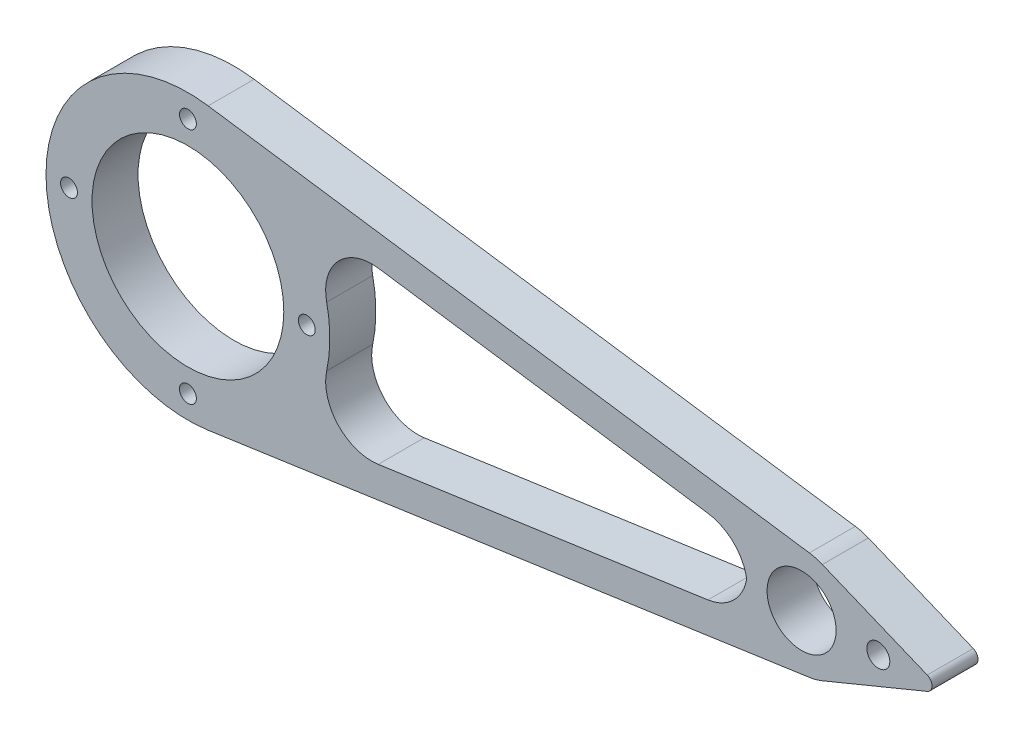
ISO-10303-21;
HEADER;
FILE_DESCRIPTION(('STEP AP214'),'2;1');
FILE_NAME('part.step','',(''),(''),'','','');
FILE_SCHEMA(('AUTOMOTIVE_DESIGN { 1 0 10303 214 1 1 1 1 }'));
ENDSEC;
DATA;
#1=APPLICATION_CONTEXT('core data for automotive mechanical design processes');
#2=APPLICATION_PROTOCOL_DEFINITION('international standard','automotive_design',2000,#1);
#3=PRODUCT_CONTEXT('',#1,'mechanical');
#4=PRODUCT('Part','Part','',(#3));
#5=PRODUCT_RELATED_PRODUCT_CATEGORY('part','',(#4));
#6=PRODUCT_DEFINITION_FORMATION('','',#4);
#7=PRODUCT_DEFINITION_CONTEXT('part definition',#1,'design');
#8=PRODUCT_DEFINITION('design','',#6,#7);
#9=PRODUCT_DEFINITION_SHAPE('','',#8);
#10=(LENGTH_UNIT() NAMED_UNIT(*) SI_UNIT(.MILLI.,.METRE.));
#11=(NAMED_UNIT(*) PLANE_ANGLE_UNIT() SI_UNIT($,.RADIAN.));
#12=(NAMED_UNIT(*) SI_UNIT($,.STERADIAN.) SOLID_ANGLE_UNIT());
#13=UNCERTAINTY_MEASURE_WITH_UNIT(LENGTH_MEASURE(1.E-05),#10,'distance_accuracy_value','');
#14=(GEOMETRIC_REPRESENTATION_CONTEXT(3) GLOBAL_UNCERTAINTY_ASSIGNED_CONTEXT((#13)) GLOBAL_UNIT_ASSIGNED_CONTEXT((#10,
#11,#12)) REPRESENTATION_CONTEXT('',''));
#15=CARTESIAN_POINT('',(0.,0.,0.));
#16=DIRECTION('',(0.,0.,1.));
#17=DIRECTION('',(1.,0.,0.));
#18=AXIS2_PLACEMENT_3D('',#15,#16,#17);
#19=CARTESIAN_POINT('',(80.,0.,0.));
#20=DIRECTION('',(0.,0.,1.));
#21=DIRECTION('',(1.,0.,0.));
#22=AXIS2_PLACEMENT_3D('',#19,#20,#21);
#23=CYLINDRICAL_SURFACE('',#22,7.09999999999999);
#24=CARTESIAN_POINT('',(80.,0.,6.));
#25=DIRECTION('',(0.,0.,1.));
#26=DIRECTION('',(1.,0.,0.));
#27=AXIS2_PLACEMENT_3D('',#24,#25,#26);
#28=CIRCLE('',#27,7.09999999999999);
#29=CARTESIAN_POINT('',(82.706875,6.5637510414682,6.));
#30=VERTEX_POINT('',#29);
#31=CARTESIAN_POINT('',(81.01175,7.02754309396249,6.));
#32=VERTEX_POINT('',#31);
#33=EDGE_CURVE('E181',#30,#32,#28,.T.);
#34=ORIENTED_EDGE('',*,*,#33,.F.);
#35=DIRECTION('',(0.,0.,1.));
#36=VECTOR('',#35,1.);
#37=CARTESIAN_POINT('',(82.706875,6.56375104146821,0.));
#38=LINE('',#37,#36);
#39=CARTESIAN_POINT('',(82.706875,6.56375104146821,0.));
#40=VERTEX_POINT('',#39);
#41=EDGE_CURVE('E321',#40,#30,#38,.T.);
#42=ORIENTED_EDGE('',*,*,#41,.F.);
#43=CARTESIAN_POINT('',(80.,0.,0.));
#44=DIRECTION('',(0.,0.,1.));
#45=DIRECTION('',(1.,0.,0.));
#46=AXIS2_PLACEMENT_3D('',#43,#44,#45);
#47=CIRCLE('',#46,7.09999999999999);
#48=CARTESIAN_POINT('',(81.01175,7.02754309396249,0.));
#49=VERTEX_POINT('',#48);
#50=EDGE_CURVE('E170',#40,#49,#47,.T.);
#51=ORIENTED_EDGE('',*,*,#50,.T.);
#52=DIRECTION('',(0.,0.,1.));
#53=VECTOR('',#52,1.);
#54=CARTESIAN_POINT('',(81.01175,7.02754309396249,0.));
#55=LINE('',#54,#53);
#56=EDGE_CURVE('E191',#49,#32,#55,.T.);
#57=ORIENTED_EDGE('',*,*,#56,.T.);
#58=EDGE_LOOP('',(#34,#42,#51,#57));
#59=FACE_BOUND('',#58,.T.);
#60=ADVANCED_FACE('F33',(#59),#23,.T.);
#61=CARTESIAN_POINT('',(0.,0.,6.));
#62=DIRECTION('',(0.,0.,1.));
#63=DIRECTION('',(1.,0.,0.));
#64=AXIS2_PLACEMENT_3D('',#61,#62,#63);
#65=PLANE('',#64);
#66=CARTESIAN_POINT('',(0.,0.,6.));
#67=DIRECTION('',(0.,0.,-1.));
#68=DIRECTION('',(1.,0.,0.));
#69=AXIS2_PLACEMENT_3D('',#66,#67,#68);
#70=CIRCLE('',#69,18.5);
#71=CARTESIAN_POINT('',(18.088471644346,3.88035997965291,6.));
#72=VERTEX_POINT('',#71);
#73=CARTESIAN_POINT('',(18.088471644346,-3.88035997965291,6.));
#74=VERTEX_POINT('',#73);
#75=EDGE_CURVE('E267',#72,#74,#70,.T.);
#76=ORIENTED_EDGE('',*,*,#75,.F.);
#77=CARTESIAN_POINT('',(23.9550029884582,5.13885510818899,6.));
#78=DIRECTION('',(0.,0.,1.));
#79=DIRECTION('',(1.,0.,0.));
#80=AXIS2_PLACEMENT_3D('',#77,#78,#79);
#81=CIRCLE('',#80,6.);
#82=CARTESIAN_POINT('',(24.8100029884582,11.0776239199883,6.));
#83=VERTEX_POINT('',#82);
#84=EDGE_CURVE('E42',#72,#83,#81,.F.);
#85=ORIENTED_EDGE('',*,*,#84,.T.);
#86=DIRECTION('',(-0.989794801966549,0.1425,0.));
#87=VECTOR('',#86,1.);
#88=CARTESIAN_POINT('',(13.4381264942291,12.7148242742516,6.));
#89=LINE('',#88,#87);
#90=CARTESIAN_POINT('',(67.7971456171021,4.88879790028084,6.));
#91=VERTEX_POINT('',#90);
#92=EDGE_CURVE('E264',#91,#83,#89,.T.);
#93=ORIENTED_EDGE('',*,*,#92,.F.);
#94=CARTESIAN_POINT('',(66.9421456171021,-1.04997091151846,6.));
#95=DIRECTION('',(0.,0.,1.));
#96=DIRECTION('',(1.,0.,0.));
#97=AXIS2_PLACEMENT_3D('',#94,#95,#96);
#98=CIRCLE('',#97,6.);
#99=CARTESIAN_POINT('',(72.8495613875524,0.,6.));
#100=VERTEX_POINT('',#99);
#101=EDGE_CURVE('E250',#91,#100,#98,.F.);
#102=ORIENTED_EDGE('',*,*,#101,.T.);
#103=CARTESIAN_POINT('',(66.9421456171021,1.04997091151846,6.));
#104=DIRECTION('',(0.,0.,1.));
#105=DIRECTION('',(1.,0.,0.));
#106=AXIS2_PLACEMENT_3D('',#103,#104,#105);
#107=CIRCLE('',#106,6.);
#108=CARTESIAN_POINT('',(67.7971456171021,-4.88879790028084,6.));
#109=VERTEX_POINT('',#108);
#110=EDGE_CURVE('E247',#100,#109,#107,.F.);
#111=ORIENTED_EDGE('',*,*,#110,.T.);
#112=DIRECTION('',(0.989794801966549,0.1425,0.));
#113=VECTOR('',#112,1.);
#114=CARTESIAN_POINT('',(13.4381264942291,-12.7148242742516,6.));
#115=LINE('',#114,#113);
#116=CARTESIAN_POINT('',(24.8100029884582,-11.0776239199883,6.));
#117=VERTEX_POINT('',#116);
#118=EDGE_CURVE('E277',#117,#109,#115,.T.);
#119=ORIENTED_EDGE('',*,*,#118,.F.);
#120=CARTESIAN_POINT('',(23.9550029884582,-5.13885510818899,6.));
#121=DIRECTION('',(0.,0.,1.));
#122=DIRECTION('',(1.,0.,0.));
#123=AXIS2_PLACEMENT_3D('',#120,#121,#122);
#124=CIRCLE('',#123,6.);
#125=EDGE_CURVE('E254',#117,#74,#124,.F.);
#126=ORIENTED_EDGE('',*,*,#125,.T.);
#127=EDGE_LOOP('',(#76,#85,#93,#102,#111,#119,#126));
#128=FACE_BOUND('',#127,.T.);
#129=CARTESIAN_POINT('',(3.40754351465061E-13,-15.5,6.));
#130=DIRECTION('',(0.,0.,1.));
#131=DIRECTION('',(1.,0.,0.));
#132=AXIS2_PLACEMENT_3D('',#129,#130,#131);
#133=CIRCLE('',#132,1.1);
#134=CARTESIAN_POINT('',(1.10000000000034,-15.5,6.));
#135=VERTEX_POINT('',#134);
#136=EDGE_CURVE('E203',#135,#135,#133,.T.);
#137=ORIENTED_EDGE('',*,*,#136,.F.);
#138=EDGE_LOOP('',(#137));
#139=FACE_BOUND('',#138,.T.);
#140=CARTESIAN_POINT('',(0.,0.,6.));
#141=DIRECTION('',(0.,0.,1.));
#142=DIRECTION('',(1.,0.,0.));
#143=AXIS2_PLACEMENT_3D('',#140,#141,#142);
#144=CIRCLE('',#143,12.5);
#145=CARTESIAN_POINT('',(12.5,0.,6.));
#146=VERTEX_POINT('',#145);
#147=EDGE_CURVE('E215',#146,#146,#144,.T.);
#148=ORIENTED_EDGE('',*,*,#147,.F.);
#149=EDGE_LOOP('',(#148));
#150=FACE_BOUND('',#149,.T.);
#151=CARTESIAN_POINT('',(0.,0.,6.));
#152=DIRECTION('',(0.,0.,1.));
#153=DIRECTION('',(1.,0.,0.));
#154=AXIS2_PLACEMENT_3D('',#151,#152,#153);
#155=CIRCLE('',#154,18.5);
#156=CARTESIAN_POINT('',(2.63625,18.3112038363812,6.));
#157=VERTEX_POINT('',#156);
#158=CARTESIAN_POINT('',(2.63625,-18.3112038363812,6.));
#159=VERTEX_POINT('',#158);
#160=EDGE_CURVE('E227',#157,#159,#155,.T.);
#161=ORIENTED_EDGE('',*,*,#160,.T.);
#162=DIRECTION('',(0.989794801966549,0.1425,0.));
#163=VECTOR('',#162,1.);
#164=CARTESIAN_POINT('',(2.63625,-18.3112038363812,6.));
#165=LINE('',#164,#163);
#166=CARTESIAN_POINT('',(81.01175,-7.02754309396249,6.));
#167=VERTEX_POINT('',#166);
#168=EDGE_CURVE('E178',#159,#167,#165,.T.);
#169=ORIENTED_EDGE('',*,*,#168,.T.);
#170=CARTESIAN_POINT('',(82.706875,-6.56375104146821,6.));
#171=VERTEX_POINT('',#170);
#172=EDGE_CURVE('E183',#167,#171,#28,.T.);
#173=ORIENTED_EDGE('',*,*,#172,.T.);
#174=DIRECTION('',(0.924471977671579,0.381249999999999,0.));
#175=VECTOR('',#174,1.);
#176=CARTESIAN_POINT('',(82.706875,-6.56375104146821,6.));
#177=LINE('',#176,#175);
#178=CARTESIAN_POINT('',(96.38125,-0.924471977671587,6.));
#179=VERTEX_POINT('',#178);
#180=EDGE_CURVE('E146',#171,#179,#177,.T.);
#181=ORIENTED_EDGE('',*,*,#180,.T.);
#182=CARTESIAN_POINT('',(96.,0.,6.));
#183=DIRECTION('',(0.,0.,1.));
#184=DIRECTION('',(1.,0.,0.));
#185=AXIS2_PLACEMENT_3D('',#182,#183,#184);
#186=CIRCLE('',#185,1.00000000000001);
#187=CARTESIAN_POINT('',(96.38125,0.924471977671587,6.));
#188=VERTEX_POINT('',#187);
#189=EDGE_CURVE('E318',#179,#188,#186,.T.);
#190=ORIENTED_EDGE('',*,*,#189,.T.);
#191=DIRECTION('',(-0.924471977671579,0.381249999999999,0.));
#192=VECTOR('',#191,1.);
#193=CARTESIAN_POINT('',(82.706875,6.56375104146821,6.));
#194=LINE('',#193,#192);
#195=EDGE_CURVE('E49',#188,#30,#194,.T.);
#196=ORIENTED_EDGE('',*,*,#195,.T.);
#197=ORIENTED_EDGE('',*,*,#33,.T.);
#198=DIRECTION('',(-0.989794801966549,0.1425,0.));
#199=VECTOR('',#198,1.);
#200=CARTESIAN_POINT('',(2.63625,18.3112038363812,6.));
#201=LINE('',#200,#199);
#202=EDGE_CURVE('E185',#32,#157,#201,.T.);
#203=ORIENTED_EDGE('',*,*,#202,.T.);
#204=EDGE_LOOP('',(#161,#169,#173,#181,#190,#196,#197,#203));
#205=FACE_BOUND('',#204,.T.);
#206=CARTESIAN_POINT('',(0.,15.5,6.));
#207=DIRECTION('',(0.,0.,1.));
#208=DIRECTION('',(1.,0.,0.));
#209=AXIS2_PLACEMENT_3D('',#206,#207,#208);
#210=CIRCLE('',#209,1.1);
#211=CARTESIAN_POINT('',(1.1,15.5,6.));
#212=VERTEX_POINT('',#211);
#213=EDGE_CURVE('E221',#212,#212,#210,.T.);
#214=ORIENTED_EDGE('',*,*,#213,.F.);
#215=EDGE_LOOP('',(#214));
#216=FACE_BOUND('',#215,.T.);
#217=CARTESIAN_POINT('',(15.5000000000002,1.70377175732531E-13,6.));
#218=DIRECTION('',(0.,0.,1.));
#219=DIRECTION('',(1.,0.,0.));
#220=AXIS2_PLACEMENT_3D('',#217,#218,#219);
#221=CIRCLE('',#220,1.1);
#222=CARTESIAN_POINT('',(16.6000000000002,1.70377175732531E-13,6.));
#223=VERTEX_POINT('',#222);
#224=EDGE_CURVE('E209',#223,#223,#221,.T.);
#225=ORIENTED_EDGE('',*,*,#224,.F.);
#226=EDGE_LOOP('',(#225));
#227=FACE_BOUND('',#226,.T.);
#228=CARTESIAN_POINT('',(-15.4999999999998,-1.72275378271209E-13,6.));
#229=DIRECTION('',(0.,0.,1.));
#230=DIRECTION('',(1.,0.,0.));
#231=AXIS2_PLACEMENT_3D('',#228,#229,#230);
#232=CIRCLE('',#231,1.1);
#233=CARTESIAN_POINT('',(-14.3999999999998,-1.72275378271209E-13,6.));
#234=VERTEX_POINT('',#233);
#235=EDGE_CURVE('E197',#234,#234,#232,.T.);
#236=ORIENTED_EDGE('',*,*,#235,.F.);
#237=EDGE_LOOP('',(#236));
#238=FACE_BOUND('',#237,.T.);
#239=CARTESIAN_POINT('',(80.,0.,6.));
#240=DIRECTION('',(0.,0.,1.));
#241=DIRECTION('',(1.,0.,0.));
#242=AXIS2_PLACEMENT_3D('',#239,#240,#241);
#243=CIRCLE('',#242,4.5);
#244=CARTESIAN_POINT('',(84.5,0.,6.));
#245=VERTEX_POINT('',#244);
#246=EDGE_CURVE('E293',#245,#245,#243,.T.);
#247=ORIENTED_EDGE('',*,*,#246,.F.);
#248=EDGE_LOOP('',(#247));
#249=FACE_BOUND('',#248,.T.);
#250=CARTESIAN_POINT('',(90.,0.,6.));
#251=DIRECTION('',(0.,0.,1.));
#252=DIRECTION('',(1.,0.,0.));
#253=AXIS2_PLACEMENT_3D('',#250,#251,#252);
#254=CIRCLE('',#253,1.5);
#255=CARTESIAN_POINT('',(91.5,0.,6.));
#256=VERTEX_POINT('',#255);
#257=EDGE_CURVE('E308',#256,#256,#254,.T.);
#258=ORIENTED_EDGE('',*,*,#257,.F.);
#259=EDGE_LOOP('',(#258));
#260=FACE_BOUND('',#259,.T.);
#261=ADVANCED_FACE('F262',(#128,#139,#150,#205,#216,#227,#238,#249,#260),#65,.T.);
#262=CARTESIAN_POINT('',(0.,0.,0.));
#263=DIRECTION('',(0.,0.,1.));
#264=DIRECTION('',(1.,0.,0.));
#265=AXIS2_PLACEMENT_3D('',#262,#263,#264);
#266=PLANE('',#265);
#267=CARTESIAN_POINT('',(66.9421456171021,1.04997091151846,0.));
#268=DIRECTION('',(0.,0.,1.));
#269=DIRECTION('',(1.,0.,0.));
#270=AXIS2_PLACEMENT_3D('',#267,#268,#269);
#271=CIRCLE('',#270,6.);
#272=CARTESIAN_POINT('',(67.7971456171021,-4.88879790028084,0.));
#273=VERTEX_POINT('',#272);
#274=CARTESIAN_POINT('',(72.8495613875524,0.,0.));
#275=VERTEX_POINT('',#274);
#276=EDGE_CURVE('E57',#273,#275,#271,.T.);
#277=ORIENTED_EDGE('',*,*,#276,.T.);
#278=CARTESIAN_POINT('',(66.9421456171021,-1.04997091151846,0.));
#279=DIRECTION('',(0.,0.,1.));
#280=DIRECTION('',(1.,0.,0.));
#281=AXIS2_PLACEMENT_3D('',#278,#279,#280);
#282=CIRCLE('',#281,6.);
#283=CARTESIAN_POINT('',(67.7971456171021,4.88879790028084,0.));
#284=VERTEX_POINT('',#283);
#285=EDGE_CURVE('E252',#275,#284,#282,.T.);
#286=ORIENTED_EDGE('',*,*,#285,.T.);
#287=DIRECTION('',(-0.989794801966549,0.1425,0.));
#288=VECTOR('',#287,1.);
#289=CARTESIAN_POINT('',(13.4381264942291,12.7148242742516,0.));
#290=LINE('',#289,#288);
#291=CARTESIAN_POINT('',(24.8100029884582,11.0776239199883,0.));
#292=VERTEX_POINT('',#291);
#293=EDGE_CURVE('E283',#284,#292,#290,.T.);
#294=ORIENTED_EDGE('',*,*,#293,.T.);
#295=CARTESIAN_POINT('',(23.9550029884582,5.13885510818899,0.));
#296=DIRECTION('',(0.,0.,1.));
#297=DIRECTION('',(1.,0.,0.));
#298=AXIS2_PLACEMENT_3D('',#295,#296,#297);
#299=CIRCLE('',#298,6.);
#300=CARTESIAN_POINT('',(18.088471644346,3.88035997965291,0.));
#301=VERTEX_POINT('',#300);
#302=EDGE_CURVE('E11',#292,#301,#299,.T.);
#303=ORIENTED_EDGE('',*,*,#302,.T.);
#304=CARTESIAN_POINT('',(0.,0.,0.));
#305=DIRECTION('',(0.,0.,-1.));
#306=DIRECTION('',(1.,0.,0.));
#307=AXIS2_PLACEMENT_3D('',#304,#305,#306);
#308=CIRCLE('',#307,18.5);
#309=CARTESIAN_POINT('',(18.088471644346,-3.88035997965291,0.));
#310=VERTEX_POINT('',#309);
#311=EDGE_CURVE('E276',#301,#310,#308,.T.);
#312=ORIENTED_EDGE('',*,*,#311,.T.);
#313=CARTESIAN_POINT('',(23.9550029884582,-5.13885510818899,0.));
#314=DIRECTION('',(0.,0.,1.));
#315=DIRECTION('',(1.,0.,0.));
#316=AXIS2_PLACEMENT_3D('',#313,#314,#315);
#317=CIRCLE('',#316,6.);
#318=CARTESIAN_POINT('',(24.8100029884582,-11.0776239199883,0.));
#319=VERTEX_POINT('',#318);
#320=EDGE_CURVE('E256',#310,#319,#317,.T.);
#321=ORIENTED_EDGE('',*,*,#320,.T.);
#322=DIRECTION('',(0.989794801966549,0.1425,0.));
#323=VECTOR('',#322,1.);
#324=CARTESIAN_POINT('',(13.4381264942291,-12.7148242742516,0.));
#325=LINE('',#324,#323);
#326=EDGE_CURVE('E287',#319,#273,#325,.T.);
#327=ORIENTED_EDGE('',*,*,#326,.T.);
#328=EDGE_LOOP('',(#277,#286,#294,#303,#312,#321,#327));
#329=FACE_BOUND('',#328,.T.);
#330=CARTESIAN_POINT('',(0.,0.,0.));
#331=DIRECTION('',(0.,0.,1.));
#332=DIRECTION('',(1.,0.,0.));
#333=AXIS2_PLACEMENT_3D('',#330,#331,#332);
#334=CIRCLE('',#333,18.5);
#335=CARTESIAN_POINT('',(2.63625,18.3112038363812,0.));
#336=VERTEX_POINT('',#335);
#337=CARTESIAN_POINT('',(2.63625,-18.3112038363812,0.));
#338=VERTEX_POINT('',#337);
#339=EDGE_CURVE('E224',#336,#338,#334,.T.);
#340=ORIENTED_EDGE('',*,*,#339,.F.);
#341=DIRECTION('',(-0.989794801966549,0.1425,0.));
#342=VECTOR('',#341,1.);
#343=CARTESIAN_POINT('',(2.63625,18.3112038363812,0.));
#344=LINE('',#343,#342);
#345=EDGE_CURVE('E169',#49,#336,#344,.T.);
#346=ORIENTED_EDGE('',*,*,#345,.F.);
#347=ORIENTED_EDGE('',*,*,#50,.F.);
#348=DIRECTION('',(-0.924471977671579,0.381249999999999,0.));
#349=VECTOR('',#348,1.);
#350=CARTESIAN_POINT('',(82.706875,6.56375104146821,0.));
#351=LINE('',#350,#349);
#352=CARTESIAN_POINT('',(96.38125,0.924471977671587,0.));
#353=VERTEX_POINT('',#352);
#354=EDGE_CURVE('E152',#353,#40,#351,.T.);
#355=ORIENTED_EDGE('',*,*,#354,.F.);
#356=CARTESIAN_POINT('',(96.,0.,0.));
#357=DIRECTION('',(0.,0.,1.));
#358=DIRECTION('',(1.,0.,0.));
#359=AXIS2_PLACEMENT_3D('',#356,#357,#358);
#360=CIRCLE('',#359,1.00000000000001);
#361=CARTESIAN_POINT('',(96.38125,-0.924471977671587,0.));
#362=VERTEX_POINT('',#361);
#363=EDGE_CURVE('E165',#362,#353,#360,.T.);
#364=ORIENTED_EDGE('',*,*,#363,.F.);
#365=DIRECTION('',(0.924471977671579,0.381249999999999,0.));
#366=VECTOR('',#365,1.);
#367=CARTESIAN_POINT('',(82.706875,-6.56375104146821,0.));
#368=LINE('',#367,#366);
#369=CARTESIAN_POINT('',(82.706875,-6.56375104146821,0.));
#370=VERTEX_POINT('',#369);
#371=EDGE_CURVE('E144',#370,#362,#368,.T.);
#372=ORIENTED_EDGE('',*,*,#371,.F.);
#373=CARTESIAN_POINT('',(81.01175,-7.02754309396249,0.));
#374=VERTEX_POINT('',#373);
#375=EDGE_CURVE('E161',#374,#370,#47,.T.);
#376=ORIENTED_EDGE('',*,*,#375,.F.);
#377=DIRECTION('',(0.989794801966549,0.1425,0.));
#378=VECTOR('',#377,1.);
#379=CARTESIAN_POINT('',(2.63625,-18.3112038363812,0.));
#380=LINE('',#379,#378);
#381=EDGE_CURVE('E174',#338,#374,#380,.T.);
#382=ORIENTED_EDGE('',*,*,#381,.F.);
#383=EDGE_LOOP('',(#340,#346,#347,#355,#364,#372,#376,#382));
#384=FACE_BOUND('',#383,.T.);
#385=CARTESIAN_POINT('',(0.,15.5,0.));
#386=DIRECTION('',(0.,0.,1.));
#387=DIRECTION('',(1.,0.,0.));
#388=AXIS2_PLACEMENT_3D('',#385,#386,#387);
#389=CIRCLE('',#388,1.1);
#390=CARTESIAN_POINT('',(1.1,15.5,0.));
#391=VERTEX_POINT('',#390);
#392=EDGE_CURVE('E218',#391,#391,#389,.T.);
#393=ORIENTED_EDGE('',*,*,#392,.T.);
#394=EDGE_LOOP('',(#393));
#395=FACE_BOUND('',#394,.T.);
#396=CARTESIAN_POINT('',(0.,0.,0.));
#397=DIRECTION('',(0.,0.,1.));
#398=DIRECTION('',(1.,0.,0.));
#399=AXIS2_PLACEMENT_3D('',#396,#397,#398);
#400=CIRCLE('',#399,12.5);
#401=CARTESIAN_POINT('',(12.5,0.,0.));
#402=VERTEX_POINT('',#401);
#403=EDGE_CURVE('E212',#402,#402,#400,.T.);
#404=ORIENTED_EDGE('',*,*,#403,.T.);
#405=EDGE_LOOP('',(#404));
#406=FACE_BOUND('',#405,.T.);
#407=CARTESIAN_POINT('',(15.5000000000002,1.70377175732531E-13,0.));
#408=DIRECTION('',(0.,0.,1.));
#409=DIRECTION('',(1.,0.,0.));
#410=AXIS2_PLACEMENT_3D('',#407,#408,#409);
#411=CIRCLE('',#410,1.1);
#412=CARTESIAN_POINT('',(16.6000000000002,1.70377175732531E-13,0.));
#413=VERTEX_POINT('',#412);
#414=EDGE_CURVE('E206',#413,#413,#411,.T.);
#415=ORIENTED_EDGE('',*,*,#414,.T.);
#416=EDGE_LOOP('',(#415));
#417=FACE_BOUND('',#416,.T.);
#418=CARTESIAN_POINT('',(3.40754351465061E-13,-15.5,0.));
#419=DIRECTION('',(0.,0.,1.));
#420=DIRECTION('',(1.,0.,0.));
#421=AXIS2_PLACEMENT_3D('',#418,#419,#420);
#422=CIRCLE('',#421,1.1);
#423=CARTESIAN_POINT('',(1.10000000000034,-15.5,0.));
#424=VERTEX_POINT('',#423);
#425=EDGE_CURVE('E200',#424,#424,#422,.T.);
#426=ORIENTED_EDGE('',*,*,#425,.T.);
#427=EDGE_LOOP('',(#426));
#428=FACE_BOUND('',#427,.T.);
#429=CARTESIAN_POINT('',(-15.4999999999998,-1.72275378271209E-13,0.));
#430=DIRECTION('',(0.,0.,1.));
#431=DIRECTION('',(1.,0.,0.));
#432=AXIS2_PLACEMENT_3D('',#429,#430,#431);
#433=CIRCLE('',#432,1.1);
#434=CARTESIAN_POINT('',(-14.3999999999998,-1.72275378271209E-13,0.));
#435=VERTEX_POINT('',#434);
#436=EDGE_CURVE('E190',#435,#435,#433,.T.);
#437=ORIENTED_EDGE('',*,*,#436,.T.);
#438=EDGE_LOOP('',(#437));
#439=FACE_BOUND('',#438,.T.);
#440=CARTESIAN_POINT('',(80.,0.,0.));
#441=DIRECTION('',(0.,0.,1.));
#442=DIRECTION('',(1.,0.,0.));
#443=AXIS2_PLACEMENT_3D('',#440,#441,#442);
#444=CIRCLE('',#443,4.5);
#445=CARTESIAN_POINT('',(84.5,0.,0.));
#446=VERTEX_POINT('',#445);
#447=EDGE_CURVE('E182',#446,#446,#444,.T.);
#448=ORIENTED_EDGE('',*,*,#447,.T.);
#449=EDGE_LOOP('',(#448));
#450=FACE_BOUND('',#449,.T.);
#451=CARTESIAN_POINT('',(90.,0.,0.));
#452=DIRECTION('',(0.,0.,1.));
#453=DIRECTION('',(1.,0.,0.));
#454=AXIS2_PLACEMENT_3D('',#451,#452,#453);
#455=CIRCLE('',#454,1.5);
#456=CARTESIAN_POINT('',(91.5,0.,0.));
#457=VERTEX_POINT('',#456);
#458=EDGE_CURVE('E310',#457,#457,#455,.T.);
#459=ORIENTED_EDGE('',*,*,#458,.T.);
#460=EDGE_LOOP('',(#459));
#461=FACE_BOUND('',#460,.T.);
#462=ADVANCED_FACE('F158',(#329,#384,#395,#406,#417,#428,#439,#450,#461),#266,.F.);
#463=CARTESIAN_POINT('',(0.,0.,6.));
#464=DIRECTION('',(0.,0.,-1.));
#465=DIRECTION('',(-1.,0.,0.));
#466=AXIS2_PLACEMENT_3D('',#463,#464,#465);
#467=CYLINDRICAL_SURFACE('',#466,18.5);
#468=ORIENTED_EDGE('',*,*,#160,.F.);
#469=DIRECTION('',(0.,0.,1.));
#470=VECTOR('',#469,1.);
#471=CARTESIAN_POINT('',(2.63625,18.3112038363812,0.));
#472=LINE('',#471,#470);
#473=EDGE_CURVE('E187',#336,#157,#472,.T.);
#474=ORIENTED_EDGE('',*,*,#473,.F.);
#475=ORIENTED_EDGE('',*,*,#339,.T.);
#476=DIRECTION('',(0.,0.,1.));
#477=VECTOR('',#476,1.);
#478=CARTESIAN_POINT('',(2.63625,-18.3112038363812,0.));
#479=LINE('',#478,#477);
#480=EDGE_CURVE('E172',#338,#159,#479,.T.);
#481=ORIENTED_EDGE('',*,*,#480,.T.);
#482=EDGE_LOOP('',(#468,#474,#475,#481));
#483=FACE_BOUND('',#482,.T.);
#484=ADVANCED_FACE('F332',(#483),#467,.T.);
#485=CARTESIAN_POINT('',(0.,15.5,6.));
#486=DIRECTION('',(0.,0.,-1.));
#487=DIRECTION('',(-1.,0.,0.));
#488=AXIS2_PLACEMENT_3D('',#485,#486,#487);
#489=CYLINDRICAL_SURFACE('',#488,1.1);
#490=ORIENTED_EDGE('',*,*,#213,.T.);
#491=EDGE_LOOP('',(#490));
#492=FACE_BOUND('',#491,.T.);
#493=ORIENTED_EDGE('',*,*,#392,.F.);
#494=EDGE_LOOP('',(#493));
#495=FACE_BOUND('',#494,.T.);
#496=ADVANCED_FACE('F400',(#492,#495),#489,.F.);
#497=CARTESIAN_POINT('',(0.,0.,6.));
#498=DIRECTION('',(0.,0.,-1.));
#499=DIRECTION('',(-1.,0.,0.));
#500=AXIS2_PLACEMENT_3D('',#497,#498,#499);
#501=CYLINDRICAL_SURFACE('',#500,12.5);
#502=ORIENTED_EDGE('',*,*,#147,.T.);
#503=EDGE_LOOP('',(#502));
#504=FACE_BOUND('',#503,.T.);
#505=ORIENTED_EDGE('',*,*,#403,.F.);
#506=EDGE_LOOP('',(#505));
#507=FACE_BOUND('',#506,.T.);
#508=ADVANCED_FACE('F545',(#504,#507),#501,.F.);
#509=CARTESIAN_POINT('',(15.5000000000002,1.70377175732531E-13,6.));
#510=DIRECTION('',(0.,0.,-1.));
#511=DIRECTION('',(-1.,0.,0.));
#512=AXIS2_PLACEMENT_3D('',#509,#510,#511);
#513=CYLINDRICAL_SURFACE('',#512,1.1);
#514=ORIENTED_EDGE('',*,*,#224,.T.);
#515=EDGE_LOOP('',(#514));
#516=FACE_BOUND('',#515,.T.);
#517=ORIENTED_EDGE('',*,*,#414,.F.);
#518=EDGE_LOOP('',(#517));
#519=FACE_BOUND('',#518,.T.);
#520=ADVANCED_FACE('F535',(#516,#519),#513,.F.);
#521=CARTESIAN_POINT('',(3.40754351465061E-13,-15.5,6.));
#522=DIRECTION('',(0.,0.,-1.));
#523=DIRECTION('',(-1.,0.,0.));
#524=AXIS2_PLACEMENT_3D('',#521,#522,#523);
#525=CYLINDRICAL_SURFACE('',#524,1.1);
#526=ORIENTED_EDGE('',*,*,#136,.T.);
#527=EDGE_LOOP('',(#526));
#528=FACE_BOUND('',#527,.T.);
#529=ORIENTED_EDGE('',*,*,#425,.F.);
#530=EDGE_LOOP('',(#529));
#531=FACE_BOUND('',#530,.T.);
#532=ADVANCED_FACE('F369',(#528,#531),#525,.F.);
#533=CARTESIAN_POINT('',(-15.4999999999998,-1.72275378271209E-13,6.));
#534=DIRECTION('',(0.,0.,-1.));
#535=DIRECTION('',(-1.,0.,0.));
#536=AXIS2_PLACEMENT_3D('',#533,#534,#535);
#537=CYLINDRICAL_SURFACE('',#536,1.1);
#538=ORIENTED_EDGE('',*,*,#235,.T.);
#539=EDGE_LOOP('',(#538));
#540=FACE_BOUND('',#539,.T.);
#541=ORIENTED_EDGE('',*,*,#436,.F.);
#542=EDGE_LOOP('',(#541));
#543=FACE_BOUND('',#542,.T.);
#544=ADVANCED_FACE('F365',(#540,#543),#537,.F.);
#545=CARTESIAN_POINT('',(2.63625,18.3112038363812,0.));
#546=DIRECTION('',(0.1425,0.989794801966549,0.));
#547=DIRECTION('',(-0.989794801966549,0.1425,0.));
#548=AXIS2_PLACEMENT_3D('',#545,#546,#547);
#549=PLANE('',#548);
#550=ORIENTED_EDGE('',*,*,#202,.F.);
#551=ORIENTED_EDGE('',*,*,#56,.F.);
#552=ORIENTED_EDGE('',*,*,#345,.T.);
#553=ORIENTED_EDGE('',*,*,#473,.T.);
#554=EDGE_LOOP('',(#550,#551,#552,#553));
#555=FACE_BOUND('',#554,.T.);
#556=ADVANCED_FACE('F339',(#555),#549,.T.);
#557=DIRECTION('',(0.,0.,1.));
#558=VECTOR('',#557,1.);
#559=CARTESIAN_POINT('',(82.706875,-6.56375104146821,0.));
#560=LINE('',#559,#558);
#561=EDGE_CURVE('E141',#370,#171,#560,.T.);
#562=ORIENTED_EDGE('',*,*,#561,.T.);
#563=ORIENTED_EDGE('',*,*,#172,.F.);
#564=DIRECTION('',(0.,0.,1.));
#565=VECTOR('',#564,1.);
#566=CARTESIAN_POINT('',(81.01175,-7.02754309396249,0.));
#567=LINE('',#566,#565);
#568=EDGE_CURVE('E168',#374,#167,#567,.T.);
#569=ORIENTED_EDGE('',*,*,#568,.F.);
#570=ORIENTED_EDGE('',*,*,#375,.T.);
#571=EDGE_LOOP('',(#562,#563,#569,#570));
#572=FACE_BOUND('',#571,.T.);
#573=ADVANCED_FACE('F167',(#572),#23,.T.);
#574=CARTESIAN_POINT('',(2.63625,-18.3112038363812,0.));
#575=DIRECTION('',(0.1425,-0.989794801966549,0.));
#576=DIRECTION('',(0.989794801966549,0.1425,0.));
#577=AXIS2_PLACEMENT_3D('',#574,#575,#576);
#578=PLANE('',#577);
#579=ORIENTED_EDGE('',*,*,#168,.F.);
#580=ORIENTED_EDGE('',*,*,#480,.F.);
#581=ORIENTED_EDGE('',*,*,#381,.T.);
#582=ORIENTED_EDGE('',*,*,#568,.T.);
#583=EDGE_LOOP('',(#579,#580,#581,#582));
#584=FACE_BOUND('',#583,.T.);
#585=ADVANCED_FACE('F330',(#584),#578,.T.);
#586=CARTESIAN_POINT('',(80.,0.,0.));
#587=DIRECTION('',(0.,0.,1.));
#588=DIRECTION('',(1.,0.,0.));
#589=AXIS2_PLACEMENT_3D('',#586,#587,#588);
#590=CYLINDRICAL_SURFACE('',#589,4.5);
#591=ORIENTED_EDGE('',*,*,#447,.F.);
#592=EDGE_LOOP('',(#591));
#593=FACE_BOUND('',#592,.T.);
#594=ORIENTED_EDGE('',*,*,#246,.T.);
#595=EDGE_LOOP('',(#594));
#596=FACE_BOUND('',#595,.T.);
#597=ADVANCED_FACE('F301',(#593,#596),#590,.F.);
#598=CARTESIAN_POINT('',(0.,0.,0.));
#599=DIRECTION('',(0.,0.,1.));
#600=DIRECTION('',(1.,0.,0.));
#601=AXIS2_PLACEMENT_3D('',#598,#599,#600);
#602=CYLINDRICAL_SURFACE('',#601,18.5);
#603=ORIENTED_EDGE('',*,*,#75,.T.);
#604=DIRECTION('',(0.,0.,1.));
#605=VECTOR('',#604,1.);
#606=CARTESIAN_POINT('',(18.088471644346,-3.88035997965291,0.));
#607=LINE('',#606,#605);
#608=EDGE_CURVE('E245',#74,#310,#607,.F.);
#609=ORIENTED_EDGE('',*,*,#608,.T.);
#610=ORIENTED_EDGE('',*,*,#311,.F.);
#611=DIRECTION('',(0.,0.,1.));
#612=VECTOR('',#611,1.);
#613=CARTESIAN_POINT('',(18.088471644346,3.88035997965291,0.));
#614=LINE('',#613,#612);
#615=EDGE_CURVE('E242',#301,#72,#614,.T.);
#616=ORIENTED_EDGE('',*,*,#615,.T.);
#617=EDGE_LOOP('',(#603,#609,#610,#616));
#618=FACE_BOUND('',#617,.T.);
#619=ADVANCED_FACE('F285',(#618),#602,.T.);
#620=CARTESIAN_POINT('',(13.4381264942291,12.7148242742516,0.));
#621=DIRECTION('',(0.1425,0.989794801966549,0.));
#622=DIRECTION('',(-0.989794801966549,0.1425,0.));
#623=AXIS2_PLACEMENT_3D('',#620,#621,#622);
#624=PLANE('',#623);
#625=ORIENTED_EDGE('',*,*,#293,.F.);
#626=DIRECTION('',(0.,0.,-1.));
#627=VECTOR('',#626,1.);
#628=CARTESIAN_POINT('',(67.7971456171021,4.88879790028084,6.));
#629=LINE('',#628,#627);
#630=EDGE_CURVE('E240',#284,#91,#629,.F.);
#631=ORIENTED_EDGE('',*,*,#630,.T.);
#632=ORIENTED_EDGE('',*,*,#92,.T.);
#633=DIRECTION('',(0.,0.,-1.));
#634=VECTOR('',#633,1.);
#635=CARTESIAN_POINT('',(24.8100029884582,11.0776239199883,0.));
#636=LINE('',#635,#634);
#637=EDGE_CURVE('E238',#83,#292,#636,.T.);
#638=ORIENTED_EDGE('',*,*,#637,.T.);
#639=EDGE_LOOP('',(#625,#631,#632,#638));
#640=FACE_BOUND('',#639,.T.);
#641=ADVANCED_FACE('F273',(#640),#624,.F.);
#642=CARTESIAN_POINT('',(13.4381264942291,-12.7148242742516,0.));
#643=DIRECTION('',(0.1425,-0.989794801966549,0.));
#644=DIRECTION('',(0.989794801966549,0.1425,0.));
#645=AXIS2_PLACEMENT_3D('',#642,#643,#644);
#646=PLANE('',#645);
#647=ORIENTED_EDGE('',*,*,#118,.T.);
#648=DIRECTION('',(0.,0.,-1.));
#649=VECTOR('',#648,1.);
#650=CARTESIAN_POINT('',(67.7971456171021,-4.88879790028084,0.));
#651=LINE('',#650,#649);
#652=EDGE_CURVE('E235',#109,#273,#651,.T.);
#653=ORIENTED_EDGE('',*,*,#652,.T.);
#654=ORIENTED_EDGE('',*,*,#326,.F.);
#655=DIRECTION('',(0.,0.,-1.));
#656=VECTOR('',#655,1.);
#657=CARTESIAN_POINT('',(24.8100029884582,-11.0776239199883,6.));
#658=LINE('',#657,#656);
#659=EDGE_CURVE('E230',#319,#117,#658,.F.);
#660=ORIENTED_EDGE('',*,*,#659,.T.);
#661=EDGE_LOOP('',(#647,#653,#654,#660));
#662=FACE_BOUND('',#661,.T.);
#663=ADVANCED_FACE('F378',(#662),#646,.F.);
#664=CARTESIAN_POINT('',(66.9421456171021,-1.04997091151846,0.));
#665=DIRECTION('',(0.,0.,1.));
#666=DIRECTION('',(1.,0.,0.));
#667=AXIS2_PLACEMENT_3D('',#664,#665,#666);
#668=CYLINDRICAL_SURFACE('',#667,6.);
#669=ORIENTED_EDGE('',*,*,#630,.F.);
#670=ORIENTED_EDGE('',*,*,#285,.F.);
#671=DIRECTION('',(0.,0.,1.));
#672=VECTOR('',#671,1.);
#673=CARTESIAN_POINT('',(72.8495613875524,0.,3.));
#674=LINE('',#673,#672);
#675=EDGE_CURVE('E37',#100,#275,#674,.F.);
#676=ORIENTED_EDGE('',*,*,#675,.F.);
#677=ORIENTED_EDGE('',*,*,#101,.F.);
#678=EDGE_LOOP('',(#669,#670,#676,#677));
#679=FACE_BOUND('',#678,.T.);
#680=ADVANCED_FACE('F381',(#679),#668,.F.);
#681=CARTESIAN_POINT('',(66.9421456171021,1.04997091151846,0.));
#682=DIRECTION('',(0.,0.,1.));
#683=DIRECTION('',(1.,0.,0.));
#684=AXIS2_PLACEMENT_3D('',#681,#682,#683);
#685=CYLINDRICAL_SURFACE('',#684,6.);
#686=ORIENTED_EDGE('',*,*,#276,.F.);
#687=ORIENTED_EDGE('',*,*,#652,.F.);
#688=ORIENTED_EDGE('',*,*,#110,.F.);
#689=ORIENTED_EDGE('',*,*,#675,.T.);
#690=EDGE_LOOP('',(#686,#687,#688,#689));
#691=FACE_BOUND('',#690,.T.);
#692=ADVANCED_FACE('F404',(#691),#685,.F.);
#693=CARTESIAN_POINT('',(23.9550029884582,-5.13885510818899,0.));
#694=DIRECTION('',(0.,0.,1.));
#695=DIRECTION('',(1.,0.,0.));
#696=AXIS2_PLACEMENT_3D('',#693,#694,#695);
#697=CYLINDRICAL_SURFACE('',#696,6.);
#698=ORIENTED_EDGE('',*,*,#320,.F.);
#699=ORIENTED_EDGE('',*,*,#608,.F.);
#700=ORIENTED_EDGE('',*,*,#125,.F.);
#701=ORIENTED_EDGE('',*,*,#659,.F.);
#702=EDGE_LOOP('',(#698,#699,#700,#701));
#703=FACE_BOUND('',#702,.T.);
#704=ADVANCED_FACE('F352',(#703),#697,.F.);
#705=CARTESIAN_POINT('',(23.9550029884582,5.13885510818899,0.));
#706=DIRECTION('',(0.,0.,1.));
#707=DIRECTION('',(1.,0.,0.));
#708=AXIS2_PLACEMENT_3D('',#705,#706,#707);
#709=CYLINDRICAL_SURFACE('',#708,6.);
#710=ORIENTED_EDGE('',*,*,#302,.F.);
#711=ORIENTED_EDGE('',*,*,#637,.F.);
#712=ORIENTED_EDGE('',*,*,#84,.F.);
#713=ORIENTED_EDGE('',*,*,#615,.F.);
#714=EDGE_LOOP('',(#710,#711,#712,#713));
#715=FACE_BOUND('',#714,.T.);
#716=ADVANCED_FACE('F35',(#715),#709,.F.);
#717=CARTESIAN_POINT('',(82.706875,6.56375104146821,0.));
#718=DIRECTION('',(0.381249999999999,0.924471977671579,0.));
#719=DIRECTION('',(-0.924471977671579,0.381249999999999,0.));
#720=AXIS2_PLACEMENT_3D('',#717,#718,#719);
#721=PLANE('',#720);
#722=ORIENTED_EDGE('',*,*,#195,.F.);
#723=DIRECTION('',(0.,0.,1.));
#724=VECTOR('',#723,1.);
#725=CARTESIAN_POINT('',(96.38125,0.924471977671587,0.));
#726=LINE('',#725,#724);
#727=EDGE_CURVE('E323',#353,#188,#726,.T.);
#728=ORIENTED_EDGE('',*,*,#727,.F.);
#729=ORIENTED_EDGE('',*,*,#354,.T.);
#730=ORIENTED_EDGE('',*,*,#41,.T.);
#731=EDGE_LOOP('',(#722,#728,#729,#730));
#732=FACE_BOUND('',#731,.T.);
#733=ADVANCED_FACE('F344',(#732),#721,.T.);
#734=CARTESIAN_POINT('',(96.,0.,0.));
#735=DIRECTION('',(0.,0.,1.));
#736=DIRECTION('',(1.,0.,0.));
#737=AXIS2_PLACEMENT_3D('',#734,#735,#736);
#738=CYLINDRICAL_SURFACE('',#737,1.00000000000001);
#739=ORIENTED_EDGE('',*,*,#189,.F.);
#740=DIRECTION('',(0.,0.,1.));
#741=VECTOR('',#740,1.);
#742=CARTESIAN_POINT('',(96.38125,-0.924471977671587,0.));
#743=LINE('',#742,#741);
#744=EDGE_CURVE('E151',#362,#179,#743,.T.);
#745=ORIENTED_EDGE('',*,*,#744,.F.);
#746=ORIENTED_EDGE('',*,*,#363,.T.);
#747=ORIENTED_EDGE('',*,*,#727,.T.);
#748=EDGE_LOOP('',(#739,#745,#746,#747));
#749=FACE_BOUND('',#748,.T.);
#750=ADVANCED_FACE('F326',(#749),#738,.T.);
#751=CARTESIAN_POINT('',(82.706875,-6.56375104146821,0.));
#752=DIRECTION('',(0.381249999999999,-0.924471977671579,0.));
#753=DIRECTION('',(0.924471977671579,0.381249999999999,0.));
#754=AXIS2_PLACEMENT_3D('',#751,#752,#753);
#755=PLANE('',#754);
#756=ORIENTED_EDGE('',*,*,#180,.F.);
#757=ORIENTED_EDGE('',*,*,#561,.F.);
#758=ORIENTED_EDGE('',*,*,#371,.T.);
#759=ORIENTED_EDGE('',*,*,#744,.T.);
#760=EDGE_LOOP('',(#756,#757,#758,#759));
#761=FACE_BOUND('',#760,.T.);
#762=ADVANCED_FACE('F143',(#761),#755,.T.);
#763=CARTESIAN_POINT('',(90.,0.,0.));
#764=DIRECTION('',(0.,0.,1.));
#765=DIRECTION('',(1.,0.,0.));
#766=AXIS2_PLACEMENT_3D('',#763,#764,#765);
#767=CYLINDRICAL_SURFACE('',#766,1.5);
#768=ORIENTED_EDGE('',*,*,#458,.F.);
#769=EDGE_LOOP('',(#768));
#770=FACE_BOUND('',#769,.T.);
#771=ORIENTED_EDGE('',*,*,#257,.T.);
#772=EDGE_LOOP('',(#771));
#773=FACE_BOUND('',#772,.T.);
#774=ADVANCED_FACE('F386',(#770,#773),#767,.F.);
#775=CLOSED_SHELL('',(#60,#261,#462,#484,#496,#508,#520,#532,#544,#556,#573,#585,#597,#619,#641,
#663,#680,#692,#704,#716,#733,#750,#762,#774));
#776=MANIFOLD_SOLID_BREP('B2',#775);
#777=ADVANCED_BREP_SHAPE_REPRESENTATION('',(#18,#776),#14);
#778=SHAPE_DEFINITION_REPRESENTATION(#9,#777);
ENDSEC;
END-ISO-10303-21;
